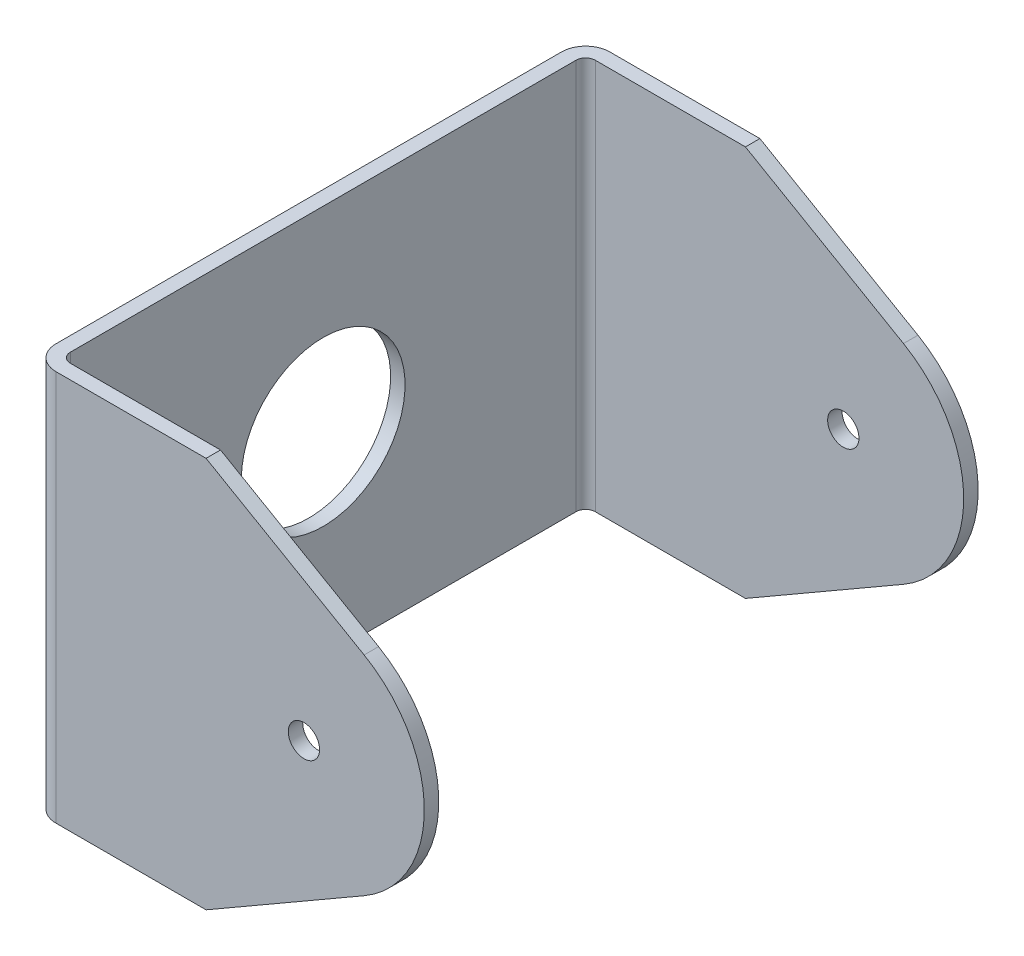
ISO-10303-21;
HEADER;
FILE_DESCRIPTION(('STEP AP214'),'2;1');
FILE_NAME('part.step','',(''),(''),'','','');
FILE_SCHEMA(('AUTOMOTIVE_DESIGN { 1 0 10303 214 1 1 1 1 }'));
ENDSEC;
DATA;
#1=APPLICATION_CONTEXT('core data for automotive mechanical design processes');
#2=APPLICATION_PROTOCOL_DEFINITION('international standard','automotive_design',2000,#1);
#3=PRODUCT_CONTEXT('',#1,'mechanical');
#4=PRODUCT('Part','Part','',(#3));
#5=PRODUCT_RELATED_PRODUCT_CATEGORY('part','',(#4));
#6=PRODUCT_DEFINITION_FORMATION('','',#4);
#7=PRODUCT_DEFINITION_CONTEXT('part definition',#1,'design');
#8=PRODUCT_DEFINITION('design','',#6,#7);
#9=PRODUCT_DEFINITION_SHAPE('','',#8);
#10=(LENGTH_UNIT() NAMED_UNIT(*) SI_UNIT(.MILLI.,.METRE.));
#11=(NAMED_UNIT(*) PLANE_ANGLE_UNIT() SI_UNIT($,.RADIAN.));
#12=(NAMED_UNIT(*) SI_UNIT($,.STERADIAN.) SOLID_ANGLE_UNIT());
#13=UNCERTAINTY_MEASURE_WITH_UNIT(LENGTH_MEASURE(1.E-05),#10,'distance_accuracy_value','');
#14=(GEOMETRIC_REPRESENTATION_CONTEXT(3) GLOBAL_UNCERTAINTY_ASSIGNED_CONTEXT((#13)) GLOBAL_UNIT_ASSIGNED_CONTEXT((#10,
#11,#12)) REPRESENTATION_CONTEXT('',''));
#15=CARTESIAN_POINT('',(0.,0.,0.));
#16=DIRECTION('',(0.,0.,1.));
#17=DIRECTION('',(1.,0.,0.));
#18=AXIS2_PLACEMENT_3D('',#15,#16,#17);
#19=CARTESIAN_POINT('',(25.,40.6,57.5));
#20=DIRECTION('',(0.,0.,-1.));
#21=DIRECTION('',(-1.,0.,0.));
#22=AXIS2_PLACEMENT_3D('',#19,#20,#21);
#23=PLANE('',#22);
#24=CARTESIAN_POINT('',(0.,0.,57.5));
#25=DIRECTION('',(0.,0.,-1.));
#26=DIRECTION('',(-1.,0.,0.));
#27=AXIS2_PLACEMENT_3D('',#24,#25,#26);
#28=CIRCLE('',#27,3.25);
#29=CARTESIAN_POINT('',(-3.25,0.,57.5));
#30=VERTEX_POINT('',#29);
#31=EDGE_CURVE('E11',#30,#30,#28,.F.);
#32=ORIENTED_EDGE('',*,*,#31,.F.);
#33=EDGE_LOOP('',(#32));
#34=FACE_BOUND('',#33,.T.);
#35=DIRECTION('',(1.,0.,0.));
#36=VECTOR('',#35,1.);
#37=CARTESIAN_POINT('',(25.,-40.6,57.5));
#38=LINE('',#37,#36);
#39=CARTESIAN_POINT('',(-51.5,-40.6,57.5));
#40=VERTEX_POINT('',#39);
#41=CARTESIAN_POINT('',(-20.3212627872969,-40.6,57.5));
#42=VERTEX_POINT('',#41);
#43=EDGE_CURVE('E278',#40,#42,#38,.T.);
#44=ORIENTED_EDGE('',*,*,#43,.T.);
#45=DIRECTION('',(0.866025403784442,0.499999999999995,0.));
#46=VECTOR('',#45,1.);
#47=CARTESIAN_POINT('',(-20.3212627872969,-40.6,57.5));
#48=LINE('',#47,#46);
#49=CARTESIAN_POINT('',(12.4999999999999,-21.6506350946111,57.5));
#50=VERTEX_POINT('',#49);
#51=EDGE_CURVE('E51',#42,#50,#48,.T.);
#52=ORIENTED_EDGE('',*,*,#51,.T.);
#53=CARTESIAN_POINT('',(0.,0.,57.5));
#54=DIRECTION('',(0.,0.,1.));
#55=DIRECTION('',(-1.,0.,0.));
#56=AXIS2_PLACEMENT_3D('',#53,#54,#55);
#57=CIRCLE('',#56,25.);
#58=CARTESIAN_POINT('',(12.4999999999999,21.6506350946111,57.5));
#59=VERTEX_POINT('',#58);
#60=EDGE_CURVE('E323',#50,#59,#57,.T.);
#61=ORIENTED_EDGE('',*,*,#60,.T.);
#62=DIRECTION('',(-0.866025403784442,0.499999999999994,0.));
#63=VECTOR('',#62,1.);
#64=CARTESIAN_POINT('',(-20.3212627872969,40.6,57.5));
#65=LINE('',#64,#63);
#66=CARTESIAN_POINT('',(-20.3212627872969,40.6,57.5));
#67=VERTEX_POINT('',#66);
#68=EDGE_CURVE('E332',#59,#67,#65,.T.);
#69=ORIENTED_EDGE('',*,*,#68,.T.);
#70=DIRECTION('',(1.,0.,0.));
#71=VECTOR('',#70,1.);
#72=CARTESIAN_POINT('',(25.,40.6,57.5));
#73=LINE('',#72,#71);
#74=CARTESIAN_POINT('',(-51.5,40.6,57.5));
#75=VERTEX_POINT('',#74);
#76=EDGE_CURVE('E258',#75,#67,#73,.T.);
#77=ORIENTED_EDGE('',*,*,#76,.F.);
#78=DIRECTION('',(0.,-1.,0.));
#79=VECTOR('',#78,1.);
#80=CARTESIAN_POINT('',(-51.5,40.6,57.5));
#81=LINE('',#80,#79);
#82=EDGE_CURVE('E182',#75,#40,#81,.T.);
#83=ORIENTED_EDGE('',*,*,#82,.T.);
#84=EDGE_LOOP('',(#44,#52,#61,#69,#77,#83));
#85=FACE_BOUND('',#84,.T.);
#86=ADVANCED_FACE('F36',(#34,#85),#23,.F.);
#87=CARTESIAN_POINT('',(-51.5,40.6,54.5));
#88=DIRECTION('',(0.,0.,1.));
#89=DIRECTION('',(1.,0.,0.));
#90=AXIS2_PLACEMENT_3D('',#87,#88,#89);
#91=PLANE('',#90);
#92=CARTESIAN_POINT('',(0.,0.,54.5));
#93=DIRECTION('',(0.,0.,1.));
#94=DIRECTION('',(1.,0.,0.));
#95=AXIS2_PLACEMENT_3D('',#92,#93,#94);
#96=CIRCLE('',#95,3.25);
#97=CARTESIAN_POINT('',(3.25,0.,54.5));
#98=VERTEX_POINT('',#97);
#99=EDGE_CURVE('E44',#98,#98,#96,.F.);
#100=ORIENTED_EDGE('',*,*,#99,.F.);
#101=EDGE_LOOP('',(#100));
#102=FACE_BOUND('',#101,.T.);
#103=CARTESIAN_POINT('',(0.,0.,54.5));
#104=DIRECTION('',(0.,0.,1.));
#105=DIRECTION('',(1.,0.,0.));
#106=AXIS2_PLACEMENT_3D('',#103,#104,#105);
#107=CIRCLE('',#106,25.);
#108=CARTESIAN_POINT('',(12.4999999999999,21.6506350946111,54.5));
#109=VERTEX_POINT('',#108);
#110=CARTESIAN_POINT('',(12.4999999999999,-21.6506350946111,54.5));
#111=VERTEX_POINT('',#110);
#112=EDGE_CURVE('E254',#109,#111,#107,.F.);
#113=ORIENTED_EDGE('',*,*,#112,.T.);
#114=DIRECTION('',(-0.866025403784442,-0.499999999999995,0.));
#115=VECTOR('',#114,1.);
#116=CARTESIAN_POINT('',(-8.54468430317636,-33.8007892420604,54.5));
#117=LINE('',#116,#115);
#118=CARTESIAN_POINT('',(-20.3212627872969,-40.6,54.5));
#119=VERTEX_POINT('',#118);
#120=EDGE_CURVE('E346',#111,#119,#117,.T.);
#121=ORIENTED_EDGE('',*,*,#120,.T.);
#122=DIRECTION('',(-1.,0.,0.));
#123=VECTOR('',#122,1.);
#124=CARTESIAN_POINT('',(-51.5,-40.6,54.5));
#125=LINE('',#124,#123);
#126=CARTESIAN_POINT('',(-51.5,-40.6,54.5));
#127=VERTEX_POINT('',#126);
#128=EDGE_CURVE('E281',#119,#127,#125,.T.);
#129=ORIENTED_EDGE('',*,*,#128,.T.);
#130=DIRECTION('',(0.,-1.,0.));
#131=VECTOR('',#130,1.);
#132=CARTESIAN_POINT('',(-51.5,40.6,54.5));
#133=LINE('',#132,#131);
#134=CARTESIAN_POINT('',(-51.5,40.6,54.5));
#135=VERTEX_POINT('',#134);
#136=EDGE_CURVE('E226',#135,#127,#133,.T.);
#137=ORIENTED_EDGE('',*,*,#136,.F.);
#138=DIRECTION('',(-1.,0.,0.));
#139=VECTOR('',#138,1.);
#140=CARTESIAN_POINT('',(-51.5,40.6,54.5));
#141=LINE('',#140,#139);
#142=CARTESIAN_POINT('',(-20.3212627872969,40.6,54.5));
#143=VERTEX_POINT('',#142);
#144=EDGE_CURVE('E261',#143,#135,#141,.T.);
#145=ORIENTED_EDGE('',*,*,#144,.F.);
#146=DIRECTION('',(0.866025403784442,-0.499999999999995,0.));
#147=VECTOR('',#146,1.);
#148=CARTESIAN_POINT('',(-43.7053156968244,54.10078924206,54.5));
#149=LINE('',#148,#147);
#150=EDGE_CURVE('E355',#143,#109,#149,.T.);
#151=ORIENTED_EDGE('',*,*,#150,.T.);
#152=EDGE_LOOP('',(#113,#121,#129,#137,#145,#151));
#153=FACE_BOUND('',#152,.T.);
#154=ADVANCED_FACE('F385',(#102,#153),#91,.F.);
#155=CARTESIAN_POINT('',(-53.5,40.6,-52.5));
#156=DIRECTION('',(-1.,0.,0.));
#157=DIRECTION('',(0.,0.,1.));
#158=AXIS2_PLACEMENT_3D('',#155,#156,#157);
#159=PLANE('',#158);
#160=CARTESIAN_POINT('',(-53.5,-26.7,21.2));
#161=DIRECTION('',(-1.,0.,0.));
#162=DIRECTION('',(0.,-1.,0.));
#163=AXIS2_PLACEMENT_3D('',#160,#161,#162);
#164=CIRCLE('',#163,13.9);
#165=CARTESIAN_POINT('',(-53.5,-26.7,35.1));
#166=VERTEX_POINT('',#165);
#167=CARTESIAN_POINT('',(-53.5,-26.7,7.3));
#168=VERTEX_POINT('',#167);
#169=EDGE_CURVE('E357',#166,#168,#164,.T.);
#170=ORIENTED_EDGE('',*,*,#169,.T.);
#171=DIRECTION('',(0.,-1.,0.));
#172=VECTOR('',#171,1.);
#173=CARTESIAN_POINT('',(-53.5,40.6,7.3));
#174=LINE('',#173,#172);
#175=CARTESIAN_POINT('',(-53.5,-40.6,7.3));
#176=VERTEX_POINT('',#175);
#177=EDGE_CURVE('E343',#168,#176,#174,.T.);
#178=ORIENTED_EDGE('',*,*,#177,.T.);
#179=DIRECTION('',(0.,0.,-1.));
#180=VECTOR('',#179,1.);
#181=CARTESIAN_POINT('',(-53.5,-40.6,-52.5));
#182=LINE('',#181,#180);
#183=CARTESIAN_POINT('',(-53.5,-40.6,-52.5));
#184=VERTEX_POINT('',#183);
#185=EDGE_CURVE('E285',#176,#184,#182,.T.);
#186=ORIENTED_EDGE('',*,*,#185,.T.);
#187=DIRECTION('',(0.,-1.,0.));
#188=VECTOR('',#187,1.);
#189=CARTESIAN_POINT('',(-53.5,40.6,-52.5));
#190=LINE('',#189,#188);
#191=CARTESIAN_POINT('',(-53.5,40.6,-52.5));
#192=VERTEX_POINT('',#191);
#193=EDGE_CURVE('E220',#192,#184,#190,.T.);
#194=ORIENTED_EDGE('',*,*,#193,.F.);
#195=DIRECTION('',(0.,0.,-1.));
#196=VECTOR('',#195,1.);
#197=CARTESIAN_POINT('',(-53.5,40.6,-52.5));
#198=LINE('',#197,#196);
#199=CARTESIAN_POINT('',(-53.5,40.6,52.5));
#200=VERTEX_POINT('',#199);
#201=EDGE_CURVE('E265',#200,#192,#198,.T.);
#202=ORIENTED_EDGE('',*,*,#201,.F.);
#203=DIRECTION('',(0.,-1.,0.));
#204=VECTOR('',#203,1.);
#205=CARTESIAN_POINT('',(-53.5,40.6,52.5));
#206=LINE('',#205,#204);
#207=CARTESIAN_POINT('',(-53.5,-40.6,52.5));
#208=VERTEX_POINT('',#207);
#209=EDGE_CURVE('E223',#200,#208,#206,.T.);
#210=ORIENTED_EDGE('',*,*,#209,.T.);
#211=CARTESIAN_POINT('',(-53.5,-40.6,35.1));
#212=VERTEX_POINT('',#211);
#213=EDGE_CURVE('E286',#208,#212,#182,.T.);
#214=ORIENTED_EDGE('',*,*,#213,.T.);
#215=DIRECTION('',(0.,1.,0.));
#216=VECTOR('',#215,1.);
#217=CARTESIAN_POINT('',(-53.5,40.6,35.1));
#218=LINE('',#217,#216);
#219=EDGE_CURVE('E59',#212,#166,#218,.T.);
#220=ORIENTED_EDGE('',*,*,#219,.T.);
#221=EDGE_LOOP('',(#170,#178,#186,#194,#202,#210,#214,#220));
#222=FACE_BOUND('',#221,.T.);
#223=CARTESIAN_POINT('',(-53.5,0.,0.));
#224=DIRECTION('',(-1.,0.,0.));
#225=DIRECTION('',(0.,-1.,0.));
#226=AXIS2_PLACEMENT_3D('',#223,#224,#225);
#227=CIRCLE('',#226,17.);
#228=CARTESIAN_POINT('',(-53.5,0.,17.));
#229=VERTEX_POINT('',#228);
#230=EDGE_CURVE('E250',#229,#229,#227,.T.);
#231=ORIENTED_EDGE('',*,*,#230,.T.);
#232=EDGE_LOOP('',(#231));
#233=FACE_BOUND('',#232,.T.);
#234=ADVANCED_FACE('F363',(#222,#233),#159,.F.);
#235=CARTESIAN_POINT('',(25.,40.6,-54.5));
#236=DIRECTION('',(0.,0.,-1.));
#237=DIRECTION('',(-1.,0.,0.));
#238=AXIS2_PLACEMENT_3D('',#235,#236,#237);
#239=PLANE('',#238);
#240=CARTESIAN_POINT('',(0.,0.,-54.5));
#241=DIRECTION('',(0.,0.,-1.));
#242=DIRECTION('',(-1.,0.,0.));
#243=AXIS2_PLACEMENT_3D('',#240,#241,#242);
#244=CIRCLE('',#243,3.25);
#245=CARTESIAN_POINT('',(-3.25,0.,-54.5));
#246=VERTEX_POINT('',#245);
#247=EDGE_CURVE('E240',#246,#246,#244,.F.);
#248=ORIENTED_EDGE('',*,*,#247,.F.);
#249=EDGE_LOOP('',(#248));
#250=FACE_BOUND('',#249,.T.);
#251=DIRECTION('',(1.,0.,0.));
#252=VECTOR('',#251,1.);
#253=CARTESIAN_POINT('',(25.,-40.6,-54.5));
#254=LINE('',#253,#252);
#255=CARTESIAN_POINT('',(-51.5,-40.6,-54.5));
#256=VERTEX_POINT('',#255);
#257=CARTESIAN_POINT('',(-20.3212627872969,-40.6,-54.5));
#258=VERTEX_POINT('',#257);
#259=EDGE_CURVE('E290',#256,#258,#254,.T.);
#260=ORIENTED_EDGE('',*,*,#259,.T.);
#261=DIRECTION('',(0.866025403784442,0.499999999999995,0.));
#262=VECTOR('',#261,1.);
#263=CARTESIAN_POINT('',(48.830315696824,-0.675317547305855,-54.5));
#264=LINE('',#263,#262);
#265=CARTESIAN_POINT('',(12.4999999999999,-21.6506350946111,-54.5));
#266=VERTEX_POINT('',#265);
#267=EDGE_CURVE('E349',#258,#266,#264,.T.);
#268=ORIENTED_EDGE('',*,*,#267,.T.);
#269=CARTESIAN_POINT('',(0.,0.,-54.5));
#270=DIRECTION('',(0.,0.,-1.));
#271=DIRECTION('',(-1.,0.,0.));
#272=AXIS2_PLACEMENT_3D('',#269,#270,#271);
#273=CIRCLE('',#272,25.);
#274=CARTESIAN_POINT('',(12.4999999999999,21.6506350946111,-54.5));
#275=VERTEX_POINT('',#274);
#276=EDGE_CURVE('E252',#266,#275,#273,.F.);
#277=ORIENTED_EDGE('',*,*,#276,.T.);
#278=DIRECTION('',(-0.866025403784442,0.499999999999995,0.));
#279=VECTOR('',#278,1.);
#280=CARTESIAN_POINT('',(13.6696843031761,20.9753175473054,-54.5));
#281=LINE('',#280,#279);
#282=CARTESIAN_POINT('',(-20.3212627872969,40.6,-54.5));
#283=VERTEX_POINT('',#282);
#284=EDGE_CURVE('E352',#275,#283,#281,.T.);
#285=ORIENTED_EDGE('',*,*,#284,.T.);
#286=DIRECTION('',(1.,0.,0.));
#287=VECTOR('',#286,1.);
#288=CARTESIAN_POINT('',(25.,40.6,-54.5));
#289=LINE('',#288,#287);
#290=CARTESIAN_POINT('',(-51.5,40.6,-54.5));
#291=VERTEX_POINT('',#290);
#292=EDGE_CURVE('E269',#291,#283,#289,.T.);
#293=ORIENTED_EDGE('',*,*,#292,.F.);
#294=DIRECTION('',(0.,-1.,0.));
#295=VECTOR('',#294,1.);
#296=CARTESIAN_POINT('',(-51.5,40.6,-54.5));
#297=LINE('',#296,#295);
#298=EDGE_CURVE('E217',#291,#256,#297,.T.);
#299=ORIENTED_EDGE('',*,*,#298,.T.);
#300=EDGE_LOOP('',(#260,#268,#277,#285,#293,#299));
#301=FACE_BOUND('',#300,.T.);
#302=ADVANCED_FACE('F402',(#250,#301),#239,.F.);
#303=CARTESIAN_POINT('',(-51.5,40.6,-57.5));
#304=DIRECTION('',(0.,0.,1.));
#305=DIRECTION('',(0.,-1.,0.));
#306=AXIS2_PLACEMENT_3D('',#303,#304,#305);
#307=PLANE('',#306);
#308=CARTESIAN_POINT('',(0.,0.,-57.5));
#309=DIRECTION('',(0.,0.,1.));
#310=DIRECTION('',(1.,0.,0.));
#311=AXIS2_PLACEMENT_3D('',#308,#309,#310);
#312=CIRCLE('',#311,3.25);
#313=CARTESIAN_POINT('',(3.25,0.,-57.5));
#314=VERTEX_POINT('',#313);
#315=EDGE_CURVE('E238',#314,#314,#312,.F.);
#316=ORIENTED_EDGE('',*,*,#315,.F.);
#317=EDGE_LOOP('',(#316));
#318=FACE_BOUND('',#317,.T.);
#319=CARTESIAN_POINT('',(0.,0.,-57.5));
#320=DIRECTION('',(0.,0.,1.));
#321=DIRECTION('',(-1.,0.,0.));
#322=AXIS2_PLACEMENT_3D('',#319,#320,#321);
#323=CIRCLE('',#322,25.);
#324=CARTESIAN_POINT('',(12.4999999999999,-21.6506350946111,-57.5));
#325=VERTEX_POINT('',#324);
#326=CARTESIAN_POINT('',(12.4999999999999,21.6506350946111,-57.5));
#327=VERTEX_POINT('',#326);
#328=EDGE_CURVE('E319',#325,#327,#323,.T.);
#329=ORIENTED_EDGE('',*,*,#328,.F.);
#330=DIRECTION('',(0.866025403784442,0.499999999999995,0.));
#331=VECTOR('',#330,1.);
#332=CARTESIAN_POINT('',(-20.3212627872969,-40.6,-57.5));
#333=LINE('',#332,#331);
#334=CARTESIAN_POINT('',(-20.3212627872969,-40.6,-57.5));
#335=VERTEX_POINT('',#334);
#336=EDGE_CURVE('E301',#335,#325,#333,.T.);
#337=ORIENTED_EDGE('',*,*,#336,.F.);
#338=DIRECTION('',(-1.,0.,0.));
#339=VECTOR('',#338,1.);
#340=CARTESIAN_POINT('',(-51.5,-40.6,-57.5));
#341=LINE('',#340,#339);
#342=CARTESIAN_POINT('',(-51.5,-40.6,-57.5));
#343=VERTEX_POINT('',#342);
#344=EDGE_CURVE('E204',#335,#343,#341,.T.);
#345=ORIENTED_EDGE('',*,*,#344,.T.);
#346=DIRECTION('',(0.,-1.,0.));
#347=VECTOR('',#346,1.);
#348=CARTESIAN_POINT('',(-51.5,40.6,-57.5));
#349=LINE('',#348,#347);
#350=CARTESIAN_POINT('',(-51.5,40.6,-57.5));
#351=VERTEX_POINT('',#350);
#352=EDGE_CURVE('E214',#351,#343,#349,.T.);
#353=ORIENTED_EDGE('',*,*,#352,.F.);
#354=DIRECTION('',(-1.,0.,0.));
#355=VECTOR('',#354,1.);
#356=CARTESIAN_POINT('',(-51.5,40.6,-57.5));
#357=LINE('',#356,#355);
#358=CARTESIAN_POINT('',(-20.3212627872969,40.6,-57.5));
#359=VERTEX_POINT('',#358);
#360=EDGE_CURVE('E272',#359,#351,#357,.T.);
#361=ORIENTED_EDGE('',*,*,#360,.F.);
#362=DIRECTION('',(-0.866025403784442,0.499999999999994,0.));
#363=VECTOR('',#362,1.);
#364=CARTESIAN_POINT('',(-20.3212627872969,40.6,-57.5));
#365=LINE('',#364,#363);
#366=EDGE_CURVE('E318',#327,#359,#365,.T.);
#367=ORIENTED_EDGE('',*,*,#366,.F.);
#368=EDGE_LOOP('',(#329,#337,#345,#353,#361,#367));
#369=FACE_BOUND('',#368,.T.);
#370=ADVANCED_FACE('F297',(#318,#369),#307,.F.);
#371=CARTESIAN_POINT('',(-56.5,40.6,52.5));
#372=DIRECTION('',(1.,0.,0.));
#373=DIRECTION('',(0.,-1.,0.));
#374=AXIS2_PLACEMENT_3D('',#371,#372,#373);
#375=PLANE('',#374);
#376=DIRECTION('',(0.,0.,1.));
#377=VECTOR('',#376,1.);
#378=CARTESIAN_POINT('',(-56.5,-40.6,52.5));
#379=LINE('',#378,#377);
#380=CARTESIAN_POINT('',(-56.5,-40.6,-52.5));
#381=VERTEX_POINT('',#380);
#382=CARTESIAN_POINT('',(-56.5,-40.6,7.3));
#383=VERTEX_POINT('',#382);
#384=EDGE_CURVE('E200',#381,#383,#379,.T.);
#385=ORIENTED_EDGE('',*,*,#384,.T.);
#386=DIRECTION('',(0.,-1.,0.));
#387=VECTOR('',#386,1.);
#388=CARTESIAN_POINT('',(-56.5,-40.6,7.3));
#389=LINE('',#388,#387);
#390=CARTESIAN_POINT('',(-56.5,-26.7,7.3));
#391=VERTEX_POINT('',#390);
#392=EDGE_CURVE('E310',#391,#383,#389,.T.);
#393=ORIENTED_EDGE('',*,*,#392,.F.);
#394=CARTESIAN_POINT('',(-56.5,-26.7,21.2));
#395=DIRECTION('',(-1.,0.,0.));
#396=DIRECTION('',(0.,0.,-1.));
#397=AXIS2_PLACEMENT_3D('',#394,#395,#396);
#398=CIRCLE('',#397,13.9);
#399=CARTESIAN_POINT('',(-56.5,-26.7,35.1));
#400=VERTEX_POINT('',#399);
#401=EDGE_CURVE('E193',#400,#391,#398,.T.);
#402=ORIENTED_EDGE('',*,*,#401,.F.);
#403=DIRECTION('',(0.,1.,0.));
#404=VECTOR('',#403,1.);
#405=CARTESIAN_POINT('',(-56.5,-40.6,35.1));
#406=LINE('',#405,#404);
#407=CARTESIAN_POINT('',(-56.5,-40.6,35.1));
#408=VERTEX_POINT('',#407);
#409=EDGE_CURVE('E175',#408,#400,#406,.T.);
#410=ORIENTED_EDGE('',*,*,#409,.F.);
#411=CARTESIAN_POINT('',(-56.5,-40.6,52.5));
#412=VERTEX_POINT('',#411);
#413=EDGE_CURVE('E189',#408,#412,#379,.T.);
#414=ORIENTED_EDGE('',*,*,#413,.T.);
#415=DIRECTION('',(0.,-1.,0.));
#416=VECTOR('',#415,1.);
#417=CARTESIAN_POINT('',(-56.5,40.6,52.5));
#418=LINE('',#417,#416);
#419=CARTESIAN_POINT('',(-56.5,40.6,52.5));
#420=VERTEX_POINT('',#419);
#421=EDGE_CURVE('E208',#420,#412,#418,.T.);
#422=ORIENTED_EDGE('',*,*,#421,.F.);
#423=DIRECTION('',(0.,0.,1.));
#424=VECTOR('',#423,1.);
#425=CARTESIAN_POINT('',(-56.5,40.6,52.5));
#426=LINE('',#425,#424);
#427=CARTESIAN_POINT('',(-56.5,40.6,-52.5));
#428=VERTEX_POINT('',#427);
#429=EDGE_CURVE('E211',#428,#420,#426,.T.);
#430=ORIENTED_EDGE('',*,*,#429,.F.);
#431=DIRECTION('',(0.,-1.,0.));
#432=VECTOR('',#431,1.);
#433=CARTESIAN_POINT('',(-56.5,40.6,-52.5));
#434=LINE('',#433,#432);
#435=EDGE_CURVE('E210',#428,#381,#434,.T.);
#436=ORIENTED_EDGE('',*,*,#435,.T.);
#437=EDGE_LOOP('',(#385,#393,#402,#410,#414,#422,#430,#436));
#438=FACE_BOUND('',#437,.T.);
#439=CARTESIAN_POINT('',(-56.5,0.,0.));
#440=DIRECTION('',(-1.,0.,0.));
#441=DIRECTION('',(0.,0.,1.));
#442=AXIS2_PLACEMENT_3D('',#439,#440,#441);
#443=CIRCLE('',#442,17.);
#444=CARTESIAN_POINT('',(-56.5,0.,17.));
#445=VERTEX_POINT('',#444);
#446=EDGE_CURVE('E636',#445,#445,#443,.T.);
#447=ORIENTED_EDGE('',*,*,#446,.F.);
#448=EDGE_LOOP('',(#447));
#449=FACE_BOUND('',#448,.T.);
#450=ADVANCED_FACE('F186',(#438,#449),#375,.F.);
#451=CARTESIAN_POINT('',(-51.5,40.6,52.5));
#452=DIRECTION('',(0.,1.,0.));
#453=DIRECTION('',(1.,0.,0.));
#454=AXIS2_PLACEMENT_3D('',#451,#452,#453);
#455=PLANE('',#454);
#456=DIRECTION('',(0.,0.,1.));
#457=VECTOR('',#456,1.);
#458=CARTESIAN_POINT('',(-20.3212627872968,40.6,52.5));
#459=LINE('',#458,#457);
#460=EDGE_CURVE('E236',#359,#283,#459,.T.);
#461=ORIENTED_EDGE('',*,*,#460,.F.);
#462=ORIENTED_EDGE('',*,*,#360,.T.);
#463=CARTESIAN_POINT('',(-51.5,40.6,-52.5));
#464=DIRECTION('',(0.,1.,0.));
#465=DIRECTION('',(-1.,0.,0.));
#466=AXIS2_PLACEMENT_3D('',#463,#464,#465);
#467=CIRCLE('',#466,5.);
#468=EDGE_CURVE('E274',#351,#428,#467,.T.);
#469=ORIENTED_EDGE('',*,*,#468,.T.);
#470=ORIENTED_EDGE('',*,*,#429,.T.);
#471=CARTESIAN_POINT('',(-51.5,40.6,52.5));
#472=DIRECTION('',(0.,1.,0.));
#473=DIRECTION('',(1.,0.,0.));
#474=AXIS2_PLACEMENT_3D('',#471,#472,#473);
#475=CIRCLE('',#474,5.);
#476=EDGE_CURVE('E203',#420,#75,#475,.T.);
#477=ORIENTED_EDGE('',*,*,#476,.T.);
#478=ORIENTED_EDGE('',*,*,#76,.T.);
#479=DIRECTION('',(0.,0.,-1.));
#480=VECTOR('',#479,1.);
#481=CARTESIAN_POINT('',(-20.3212627872969,40.6,57.5));
#482=LINE('',#481,#480);
#483=EDGE_CURVE('E328',#67,#143,#482,.T.);
#484=ORIENTED_EDGE('',*,*,#483,.T.);
#485=ORIENTED_EDGE('',*,*,#144,.T.);
#486=CARTESIAN_POINT('',(-51.5,40.6,52.5));
#487=DIRECTION('',(0.,-1.,0.));
#488=DIRECTION('',(1.,0.,0.));
#489=AXIS2_PLACEMENT_3D('',#486,#487,#488);
#490=CIRCLE('',#489,2.);
#491=EDGE_CURVE('E263',#135,#200,#490,.T.);
#492=ORIENTED_EDGE('',*,*,#491,.T.);
#493=ORIENTED_EDGE('',*,*,#201,.T.);
#494=CARTESIAN_POINT('',(-51.5,40.6,-52.5));
#495=DIRECTION('',(0.,-1.,0.));
#496=DIRECTION('',(1.,0.,0.));
#497=AXIS2_PLACEMENT_3D('',#494,#495,#496);
#498=CIRCLE('',#497,2.);
#499=EDGE_CURVE('E267',#192,#291,#498,.T.);
#500=ORIENTED_EDGE('',*,*,#499,.T.);
#501=ORIENTED_EDGE('',*,*,#292,.T.);
#502=EDGE_LOOP('',(#461,#462,#469,#470,#477,#478,#484,#485,#492,#493,#500,#501));
#503=FACE_BOUND('',#502,.T.);
#504=ADVANCED_FACE('F315',(#503),#455,.T.);
#505=CARTESIAN_POINT('',(-51.5,-40.6,52.5));
#506=DIRECTION('',(0.,1.,0.));
#507=DIRECTION('',(1.,0.,0.));
#508=AXIS2_PLACEMENT_3D('',#505,#506,#507);
#509=PLANE('',#508);
#510=ORIENTED_EDGE('',*,*,#344,.F.);
#511=DIRECTION('',(0.,0.,1.));
#512=VECTOR('',#511,1.);
#513=CARTESIAN_POINT('',(-20.3212627872969,-40.6,52.5));
#514=LINE('',#513,#512);
#515=EDGE_CURVE('E233',#335,#258,#514,.T.);
#516=ORIENTED_EDGE('',*,*,#515,.T.);
#517=ORIENTED_EDGE('',*,*,#259,.F.);
#518=CARTESIAN_POINT('',(-51.5,-40.6,-52.5));
#519=DIRECTION('',(0.,-1.,0.));
#520=DIRECTION('',(1.,0.,0.));
#521=AXIS2_PLACEMENT_3D('',#518,#519,#520);
#522=CIRCLE('',#521,2.);
#523=EDGE_CURVE('E288',#184,#256,#522,.T.);
#524=ORIENTED_EDGE('',*,*,#523,.F.);
#525=ORIENTED_EDGE('',*,*,#185,.F.);
#526=DIRECTION('',(-1.,0.,0.));
#527=VECTOR('',#526,1.);
#528=CARTESIAN_POINT('',(-51.5,-40.6,7.3));
#529=LINE('',#528,#527);
#530=EDGE_CURVE('E181',#176,#383,#529,.T.);
#531=ORIENTED_EDGE('',*,*,#530,.T.);
#532=ORIENTED_EDGE('',*,*,#384,.F.);
#533=CARTESIAN_POINT('',(-51.5,-40.6,-52.5));
#534=DIRECTION('',(0.,1.,0.));
#535=DIRECTION('',(-1.,0.,0.));
#536=AXIS2_PLACEMENT_3D('',#533,#534,#535);
#537=CIRCLE('',#536,5.);
#538=EDGE_CURVE('E201',#343,#381,#537,.T.);
#539=ORIENTED_EDGE('',*,*,#538,.F.);
#540=EDGE_LOOP('',(#510,#516,#517,#524,#525,#531,#532,#539));
#541=FACE_BOUND('',#540,.T.);
#542=ADVANCED_FACE('F308',(#541),#509,.F.);
#543=ORIENTED_EDGE('',*,*,#128,.F.);
#544=DIRECTION('',(0.,0.,-1.));
#545=VECTOR('',#544,1.);
#546=CARTESIAN_POINT('',(-20.3212627872969,-40.6,57.5));
#547=LINE('',#546,#545);
#548=EDGE_CURVE('E340',#42,#119,#547,.T.);
#549=ORIENTED_EDGE('',*,*,#548,.F.);
#550=ORIENTED_EDGE('',*,*,#43,.F.);
#551=CARTESIAN_POINT('',(-51.5,-40.6,52.5));
#552=DIRECTION('',(0.,1.,0.));
#553=DIRECTION('',(1.,0.,0.));
#554=AXIS2_PLACEMENT_3D('',#551,#552,#553);
#555=CIRCLE('',#554,5.);
#556=EDGE_CURVE('E199',#412,#40,#555,.T.);
#557=ORIENTED_EDGE('',*,*,#556,.F.);
#558=ORIENTED_EDGE('',*,*,#413,.F.);
#559=DIRECTION('',(1.,0.,0.));
#560=VECTOR('',#559,1.);
#561=CARTESIAN_POINT('',(-51.5,-40.6,35.1));
#562=LINE('',#561,#560);
#563=EDGE_CURVE('E172',#408,#212,#562,.T.);
#564=ORIENTED_EDGE('',*,*,#563,.T.);
#565=ORIENTED_EDGE('',*,*,#213,.F.);
#566=CARTESIAN_POINT('',(-51.5,-40.6,52.5));
#567=DIRECTION('',(0.,-1.,0.));
#568=DIRECTION('',(1.,0.,0.));
#569=AXIS2_PLACEMENT_3D('',#566,#567,#568);
#570=CIRCLE('',#569,2.);
#571=EDGE_CURVE('E283',#127,#208,#570,.T.);
#572=ORIENTED_EDGE('',*,*,#571,.F.);
#573=EDGE_LOOP('',(#543,#549,#550,#557,#558,#564,#565,#572));
#574=FACE_BOUND('',#573,.T.);
#575=ADVANCED_FACE('F197',(#574),#509,.F.);
#576=CARTESIAN_POINT('',(-51.5,40.6,52.5));
#577=DIRECTION('',(0.,-1.,0.));
#578=DIRECTION('',(-1.,0.,0.));
#579=AXIS2_PLACEMENT_3D('',#576,#577,#578);
#580=CYLINDRICAL_SURFACE('',#579,5.);
#581=ORIENTED_EDGE('',*,*,#556,.T.);
#582=ORIENTED_EDGE('',*,*,#82,.F.);
#583=ORIENTED_EDGE('',*,*,#476,.F.);
#584=ORIENTED_EDGE('',*,*,#421,.T.);
#585=EDGE_LOOP('',(#581,#582,#583,#584));
#586=FACE_BOUND('',#585,.T.);
#587=ADVANCED_FACE('F38',(#586),#580,.T.);
#588=CARTESIAN_POINT('',(-51.5,40.6,52.5));
#589=DIRECTION('',(0.,-1.,0.));
#590=DIRECTION('',(-1.,0.,0.));
#591=AXIS2_PLACEMENT_3D('',#588,#589,#590);
#592=CYLINDRICAL_SURFACE('',#591,2.);
#593=ORIENTED_EDGE('',*,*,#571,.T.);
#594=ORIENTED_EDGE('',*,*,#209,.F.);
#595=ORIENTED_EDGE('',*,*,#491,.F.);
#596=ORIENTED_EDGE('',*,*,#136,.T.);
#597=EDGE_LOOP('',(#593,#594,#595,#596));
#598=FACE_BOUND('',#597,.T.);
#599=ADVANCED_FACE('F395',(#598),#592,.F.);
#600=CARTESIAN_POINT('',(-51.5,40.6,-52.5));
#601=DIRECTION('',(0.,-1.,0.));
#602=DIRECTION('',(-1.,0.,0.));
#603=AXIS2_PLACEMENT_3D('',#600,#601,#602);
#604=CYLINDRICAL_SURFACE('',#603,2.);
#605=ORIENTED_EDGE('',*,*,#523,.T.);
#606=ORIENTED_EDGE('',*,*,#298,.F.);
#607=ORIENTED_EDGE('',*,*,#499,.F.);
#608=ORIENTED_EDGE('',*,*,#193,.T.);
#609=EDGE_LOOP('',(#605,#606,#607,#608));
#610=FACE_BOUND('',#609,.T.);
#611=ADVANCED_FACE('F398',(#610),#604,.F.);
#612=CARTESIAN_POINT('',(-51.5,40.6,-52.5));
#613=DIRECTION('',(0.,-1.,0.));
#614=DIRECTION('',(-1.,0.,0.));
#615=AXIS2_PLACEMENT_3D('',#612,#613,#614);
#616=CYLINDRICAL_SURFACE('',#615,5.);
#617=ORIENTED_EDGE('',*,*,#538,.T.);
#618=ORIENTED_EDGE('',*,*,#435,.F.);
#619=ORIENTED_EDGE('',*,*,#468,.F.);
#620=ORIENTED_EDGE('',*,*,#352,.T.);
#621=EDGE_LOOP('',(#617,#618,#619,#620));
#622=FACE_BOUND('',#621,.T.);
#623=ADVANCED_FACE('F305',(#622),#616,.T.);
#624=CARTESIAN_POINT('',(25.,-40.6,7.3));
#625=DIRECTION('',(0.,0.,-1.));
#626=DIRECTION('',(-1.,0.,0.));
#627=AXIS2_PLACEMENT_3D('',#624,#625,#626);
#628=PLANE('',#627);
#629=ORIENTED_EDGE('',*,*,#177,.F.);
#630=DIRECTION('',(-1.,0.,0.));
#631=VECTOR('',#630,1.);
#632=CARTESIAN_POINT('',(25.,-26.7,7.3));
#633=LINE('',#632,#631);
#634=EDGE_CURVE('E637',#168,#391,#633,.T.);
#635=ORIENTED_EDGE('',*,*,#634,.T.);
#636=ORIENTED_EDGE('',*,*,#392,.T.);
#637=ORIENTED_EDGE('',*,*,#530,.F.);
#638=EDGE_LOOP('',(#629,#635,#636,#637));
#639=FACE_BOUND('',#638,.T.);
#640=ADVANCED_FACE('F414',(#639),#628,.F.);
#641=CARTESIAN_POINT('',(25.,-40.6,35.1));
#642=DIRECTION('',(0.,0.,1.));
#643=DIRECTION('',(1.,0.,0.));
#644=AXIS2_PLACEMENT_3D('',#641,#642,#643);
#645=PLANE('',#644);
#646=ORIENTED_EDGE('',*,*,#219,.F.);
#647=ORIENTED_EDGE('',*,*,#563,.F.);
#648=ORIENTED_EDGE('',*,*,#409,.T.);
#649=DIRECTION('',(-1.,0.,0.));
#650=VECTOR('',#649,1.);
#651=CARTESIAN_POINT('',(25.,-26.7,35.1));
#652=LINE('',#651,#650);
#653=EDGE_CURVE('E642',#166,#400,#652,.T.);
#654=ORIENTED_EDGE('',*,*,#653,.F.);
#655=EDGE_LOOP('',(#646,#647,#648,#654));
#656=FACE_BOUND('',#655,.T.);
#657=ADVANCED_FACE('F174',(#656),#645,.F.);
#658=CARTESIAN_POINT('',(25.,-26.7,21.2));
#659=DIRECTION('',(-1.,0.,0.));
#660=DIRECTION('',(0.,0.,1.));
#661=AXIS2_PLACEMENT_3D('',#658,#659,#660);
#662=CYLINDRICAL_SURFACE('',#661,13.9);
#663=ORIENTED_EDGE('',*,*,#169,.F.);
#664=ORIENTED_EDGE('',*,*,#653,.T.);
#665=ORIENTED_EDGE('',*,*,#401,.T.);
#666=ORIENTED_EDGE('',*,*,#634,.F.);
#667=EDGE_LOOP('',(#663,#664,#665,#666));
#668=FACE_BOUND('',#667,.T.);
#669=ADVANCED_FACE('F430',(#668),#662,.F.);
#670=CARTESIAN_POINT('',(-20.3212627872969,40.6,57.5));
#671=DIRECTION('',(-0.499999999999994,-0.866025403784442,0.));
#672=DIRECTION('',(0.866025403784442,-0.499999999999995,0.));
#673=AXIS2_PLACEMENT_3D('',#670,#671,#672);
#674=PLANE('',#673);
#675=ORIENTED_EDGE('',*,*,#150,.F.);
#676=ORIENTED_EDGE('',*,*,#483,.F.);
#677=ORIENTED_EDGE('',*,*,#68,.F.);
#678=DIRECTION('',(0.,0.,-1.));
#679=VECTOR('',#678,1.);
#680=CARTESIAN_POINT('',(12.4999999999999,21.6506350946111,57.5));
#681=LINE('',#680,#679);
#682=EDGE_CURVE('E333',#59,#109,#681,.T.);
#683=ORIENTED_EDGE('',*,*,#682,.T.);
#684=EDGE_LOOP('',(#675,#676,#677,#683));
#685=FACE_BOUND('',#684,.T.);
#686=ADVANCED_FACE('F428',(#685),#674,.F.);
#687=CARTESIAN_POINT('',(-20.3212627872969,-40.6,57.5));
#688=DIRECTION('',(-0.499999999999995,0.866025403784441,0.));
#689=DIRECTION('',(-0.866025403784442,-0.499999999999995,0.));
#690=AXIS2_PLACEMENT_3D('',#687,#688,#689);
#691=PLANE('',#690);
#692=ORIENTED_EDGE('',*,*,#120,.F.);
#693=DIRECTION('',(0.,0.,-1.));
#694=VECTOR('',#693,1.);
#695=CARTESIAN_POINT('',(12.4999999999999,-21.6506350946111,57.5));
#696=LINE('',#695,#694);
#697=EDGE_CURVE('E337',#50,#111,#696,.T.);
#698=ORIENTED_EDGE('',*,*,#697,.F.);
#699=ORIENTED_EDGE('',*,*,#51,.F.);
#700=ORIENTED_EDGE('',*,*,#548,.T.);
#701=EDGE_LOOP('',(#692,#698,#699,#700));
#702=FACE_BOUND('',#701,.T.);
#703=ADVANCED_FACE('F424',(#702),#691,.F.);
#704=CARTESIAN_POINT('',(0.,0.,57.5));
#705=DIRECTION('',(0.,0.,-1.));
#706=DIRECTION('',(-1.,0.,0.));
#707=AXIS2_PLACEMENT_3D('',#704,#705,#706);
#708=CYLINDRICAL_SURFACE('',#707,25.);
#709=ORIENTED_EDGE('',*,*,#682,.F.);
#710=ORIENTED_EDGE('',*,*,#60,.F.);
#711=ORIENTED_EDGE('',*,*,#697,.T.);
#712=ORIENTED_EDGE('',*,*,#112,.F.);
#713=EDGE_LOOP('',(#709,#710,#711,#712));
#714=FACE_BOUND('',#713,.T.);
#715=ADVANCED_FACE('F381',(#714),#708,.T.);
#716=ORIENTED_EDGE('',*,*,#284,.F.);
#717=EDGE_CURVE('E331',#275,#327,#681,.T.);
#718=ORIENTED_EDGE('',*,*,#717,.T.);
#719=ORIENTED_EDGE('',*,*,#366,.T.);
#720=ORIENTED_EDGE('',*,*,#460,.T.);
#721=EDGE_LOOP('',(#716,#718,#719,#720));
#722=FACE_BOUND('',#721,.T.);
#723=ADVANCED_FACE('F422',(#722),#674,.F.);
#724=ORIENTED_EDGE('',*,*,#267,.F.);
#725=ORIENTED_EDGE('',*,*,#515,.F.);
#726=ORIENTED_EDGE('',*,*,#336,.T.);
#727=EDGE_CURVE('E336',#266,#325,#696,.T.);
#728=ORIENTED_EDGE('',*,*,#727,.F.);
#729=EDGE_LOOP('',(#724,#725,#726,#728));
#730=FACE_BOUND('',#729,.T.);
#731=ADVANCED_FACE('F378',(#730),#691,.F.);
#732=ORIENTED_EDGE('',*,*,#276,.F.);
#733=ORIENTED_EDGE('',*,*,#727,.T.);
#734=ORIENTED_EDGE('',*,*,#328,.T.);
#735=ORIENTED_EDGE('',*,*,#717,.F.);
#736=EDGE_LOOP('',(#732,#733,#734,#735));
#737=FACE_BOUND('',#736,.T.);
#738=ADVANCED_FACE('F368',(#737),#708,.T.);
#739=CARTESIAN_POINT('',(25.,0.,0.));
#740=DIRECTION('',(-1.,0.,0.));
#741=DIRECTION('',(0.,0.,1.));
#742=AXIS2_PLACEMENT_3D('',#739,#740,#741);
#743=CYLINDRICAL_SURFACE('',#742,17.);
#744=CARTESIAN_POINT('',(-56.5,0.,17.));
#745=CARTESIAN_POINT('',(-56.46875,0.,17.));
#746=CARTESIAN_POINT('',(-56.4375,0.,17.));
#747=CARTESIAN_POINT('',(-56.375,0.,17.));
#748=CARTESIAN_POINT('',(-56.34375,0.,17.));
#749=CARTESIAN_POINT('',(-56.28125,0.,17.));
#750=CARTESIAN_POINT('',(-56.25,0.,17.));
#751=CARTESIAN_POINT('',(-56.1875,0.,17.));
#752=CARTESIAN_POINT('',(-56.15625,0.,17.));
#753=CARTESIAN_POINT('',(-56.09375,0.,17.));
#754=CARTESIAN_POINT('',(-56.0625,0.,17.));
#755=CARTESIAN_POINT('',(-56.,0.,17.));
#756=CARTESIAN_POINT('',(-55.96875,0.,17.));
#757=CARTESIAN_POINT('',(-55.90625,0.,17.));
#758=CARTESIAN_POINT('',(-55.875,0.,17.));
#759=CARTESIAN_POINT('',(-55.8125,0.,17.));
#760=CARTESIAN_POINT('',(-55.78125,0.,17.));
#761=CARTESIAN_POINT('',(-55.71875,0.,17.));
#762=CARTESIAN_POINT('',(-55.6875,0.,17.));
#763=CARTESIAN_POINT('',(-55.625,0.,17.));
#764=CARTESIAN_POINT('',(-55.59375,0.,17.));
#765=CARTESIAN_POINT('',(-55.53125,0.,17.));
#766=CARTESIAN_POINT('',(-55.5,0.,17.));
#767=CARTESIAN_POINT('',(-55.4375,0.,17.));
#768=CARTESIAN_POINT('',(-55.40625,0.,17.));
#769=CARTESIAN_POINT('',(-55.34375,0.,17.));
#770=CARTESIAN_POINT('',(-55.3125,0.,17.));
#771=CARTESIAN_POINT('',(-55.25,0.,17.));
#772=CARTESIAN_POINT('',(-55.21875,0.,17.));
#773=CARTESIAN_POINT('',(-55.15625,0.,17.));
#774=CARTESIAN_POINT('',(-55.125,0.,17.));
#775=CARTESIAN_POINT('',(-55.0625,0.,17.));
#776=CARTESIAN_POINT('',(-55.03125,0.,17.));
#777=CARTESIAN_POINT('',(-54.96875,0.,17.));
#778=CARTESIAN_POINT('',(-54.9375,0.,17.));
#779=CARTESIAN_POINT('',(-54.875,0.,17.));
#780=CARTESIAN_POINT('',(-54.84375,0.,17.));
#781=CARTESIAN_POINT('',(-54.78125,0.,17.));
#782=CARTESIAN_POINT('',(-54.75,0.,17.));
#783=CARTESIAN_POINT('',(-54.6875,0.,17.));
#784=CARTESIAN_POINT('',(-54.65625,0.,17.));
#785=CARTESIAN_POINT('',(-54.59375,0.,17.));
#786=CARTESIAN_POINT('',(-54.5625,0.,17.));
#787=CARTESIAN_POINT('',(-54.5,0.,17.));
#788=CARTESIAN_POINT('',(-54.46875,0.,17.));
#789=CARTESIAN_POINT('',(-54.40625,0.,17.));
#790=CARTESIAN_POINT('',(-54.375,0.,17.));
#791=CARTESIAN_POINT('',(-54.3125,0.,17.));
#792=CARTESIAN_POINT('',(-54.28125,0.,17.));
#793=CARTESIAN_POINT('',(-54.21875,0.,17.));
#794=CARTESIAN_POINT('',(-54.1875,0.,17.));
#795=CARTESIAN_POINT('',(-54.125,0.,17.));
#796=CARTESIAN_POINT('',(-54.09375,0.,17.));
#797=CARTESIAN_POINT('',(-54.03125,0.,17.));
#798=CARTESIAN_POINT('',(-54.,0.,17.));
#799=CARTESIAN_POINT('',(-53.9375,0.,17.));
#800=CARTESIAN_POINT('',(-53.90625,0.,17.));
#801=CARTESIAN_POINT('',(-53.84375,0.,17.));
#802=CARTESIAN_POINT('',(-53.8125,0.,17.));
#803=CARTESIAN_POINT('',(-53.75,0.,17.));
#804=CARTESIAN_POINT('',(-53.71875,0.,17.));
#805=CARTESIAN_POINT('',(-53.65625,0.,17.));
#806=CARTESIAN_POINT('',(-53.625,0.,17.));
#807=CARTESIAN_POINT('',(-53.5625,0.,17.));
#808=CARTESIAN_POINT('',(-53.53125,0.,17.));
#809=CARTESIAN_POINT('',(-53.5,0.,17.));
#810=B_SPLINE_CURVE_WITH_KNOTS('',3,(#744,#745,#746,#747,#748,#749,#750,#751,#752,#753,#754,
#755,#756,#757,#758,#759,#760,#761,#762,#763,#764,#765,#766,#767,#768,#769,#770,#771,#772,#773,
#774,#775,#776,#777,#778,#779,#780,#781,#782,#783,#784,#785,#786,#787,#788,#789,#790,#791,#792,
#793,#794,#795,#796,#797,#798,#799,#800,#801,#802,#803,#804,#805,#806,#807,#808,#809),
.UNSPECIFIED.,.F.,.F.,(4,2,2,2,2,2,2,2,2,2,2,2,2,2,2,2,2,2,2,2,2,2,2,2,2,2,2,2,2,2,2,2,4),(0.,
0.0937500000000036,0.187500000000007,0.281249999999997,0.375,0.468750000000004,
0.562500000000007,0.656250000000011,0.750000000000001,0.843750000000004,0.937500000000008,
1.03125000000001,1.12500000000001,1.21875000000002,1.31250000000001,1.40625000000001,
1.50000000000002,1.59375000000002,1.68750000000002,1.78125000000001,1.87500000000002,
1.96875000000002,2.06250000000002,2.15625000000003,2.25000000000003,2.34375000000002,
2.43750000000002,2.53125000000003,2.62500000000003,2.71875000000003,2.81250000000002,
2.90625000000003,3.00000000000003),.UNSPECIFIED.);
#811=EDGE_CURVE('BSEAM365',#445,#229,#810,.T.);
#812=ORIENTED_EDGE('',*,*,#446,.T.);
#813=ORIENTED_EDGE('',*,*,#230,.F.);
#814=ORIENTED_EDGE('',*,*,#811,.T.);
#815=ORIENTED_EDGE('',*,*,#811,.F.);
#816=EDGE_LOOP('',(#812,#814,#813,#815));
#817=FACE_BOUND('',#816,.T.);
#818=ADVANCED_FACE('F365',(#817),#743,.F.);
#819=CARTESIAN_POINT('',(0.,0.,57.5));
#820=DIRECTION('',(0.,0.,-1.));
#821=DIRECTION('',(-1.,0.,0.));
#822=AXIS2_PLACEMENT_3D('',#819,#820,#821);
#823=CYLINDRICAL_SURFACE('',#822,3.25);
#824=ORIENTED_EDGE('',*,*,#315,.T.);
#825=EDGE_LOOP('',(#824));
#826=FACE_BOUND('',#825,.T.);
#827=ORIENTED_EDGE('',*,*,#247,.T.);
#828=EDGE_LOOP('',(#827));
#829=FACE_BOUND('',#828,.T.);
#830=ADVANCED_FACE('F367',(#826,#829),#823,.F.);
#831=ORIENTED_EDGE('',*,*,#31,.T.);
#832=EDGE_LOOP('',(#831));
#833=FACE_BOUND('',#832,.T.);
#834=ORIENTED_EDGE('',*,*,#99,.T.);
#835=EDGE_LOOP('',(#834));
#836=FACE_BOUND('',#835,.T.);
#837=ADVANCED_FACE('F375',(#833,#836),#823,.F.);
#838=CLOSED_SHELL('',(#86,#154,#234,#302,#370,#450,#504,#542,#575,#587,#599,#611,#623,#640,#657,
#669,#686,#703,#715,#723,#731,#738,#818,#830,#837));
#839=MANIFOLD_SOLID_BREP('B2',#838);
#840=ADVANCED_BREP_SHAPE_REPRESENTATION('',(#18,#839),#14);
#841=SHAPE_DEFINITION_REPRESENTATION(#9,#840);
ENDSEC;
END-ISO-10303-21;
